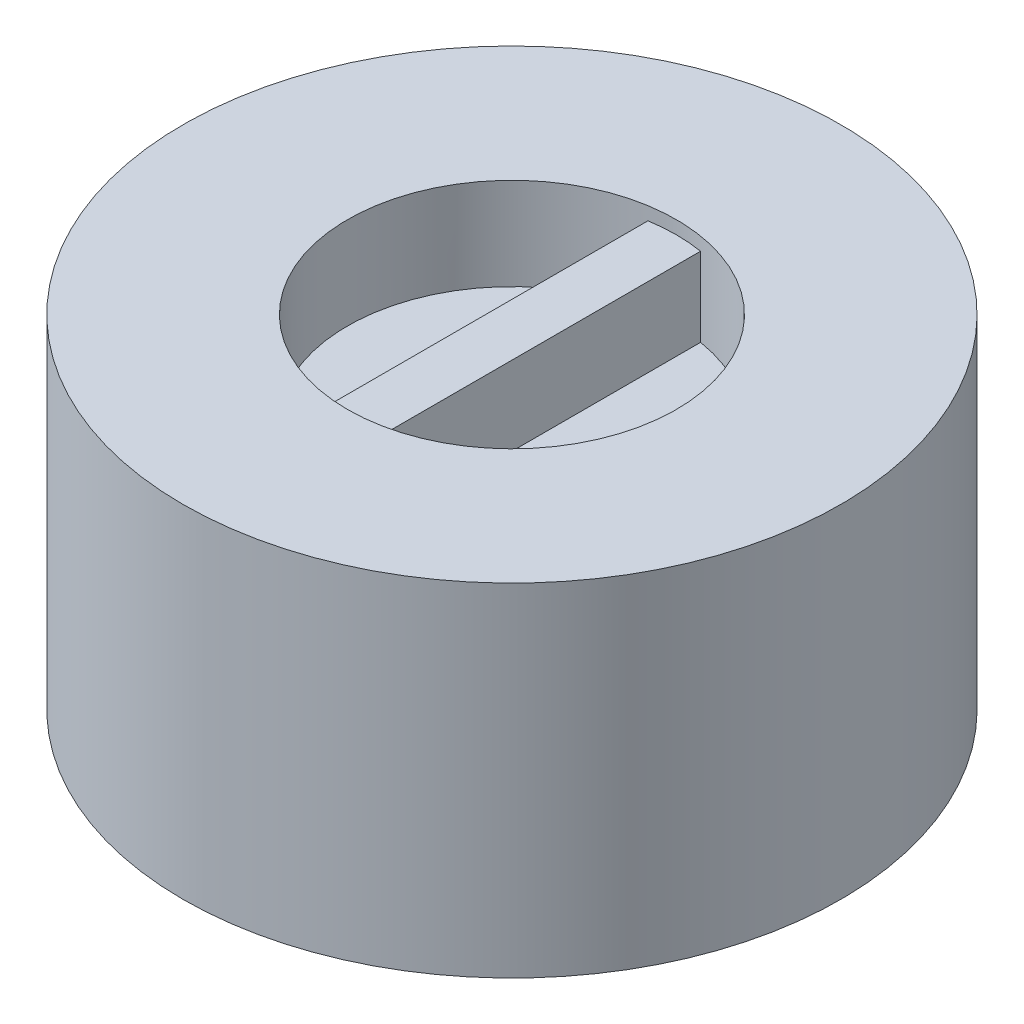
ISO-10303-21;
HEADER;
FILE_DESCRIPTION(('STEP AP214'),'2;1');
FILE_NAME('part.step','',(''),(''),'','','');
FILE_SCHEMA(('AUTOMOTIVE_DESIGN { 1 0 10303 214 1 1 1 1 }'));
ENDSEC;
DATA;
#1=APPLICATION_CONTEXT('core data for automotive mechanical design processes');
#2=APPLICATION_PROTOCOL_DEFINITION('international standard','automotive_design',2000,#1);
#3=PRODUCT_CONTEXT('',#1,'mechanical');
#4=PRODUCT('Part','Part','',(#3));
#5=PRODUCT_RELATED_PRODUCT_CATEGORY('part','',(#4));
#6=PRODUCT_DEFINITION_FORMATION('','',#4);
#7=PRODUCT_DEFINITION_CONTEXT('part definition',#1,'design');
#8=PRODUCT_DEFINITION('design','',#6,#7);
#9=PRODUCT_DEFINITION_SHAPE('','',#8);
#10=(LENGTH_UNIT() NAMED_UNIT(*) SI_UNIT(.MILLI.,.METRE.));
#11=(NAMED_UNIT(*) PLANE_ANGLE_UNIT() SI_UNIT($,.RADIAN.));
#12=(NAMED_UNIT(*) SI_UNIT($,.STERADIAN.) SOLID_ANGLE_UNIT());
#13=UNCERTAINTY_MEASURE_WITH_UNIT(LENGTH_MEASURE(1.E-05),#10,'distance_accuracy_value','');
#14=(GEOMETRIC_REPRESENTATION_CONTEXT(3) GLOBAL_UNCERTAINTY_ASSIGNED_CONTEXT((#13)) GLOBAL_UNIT_ASSIGNED_CONTEXT((#10,
#11,#12)) REPRESENTATION_CONTEXT('',''));
#15=CARTESIAN_POINT('',(0.,0.,0.));
#16=DIRECTION('',(0.,0.,1.));
#17=DIRECTION('',(1.,0.,0.));
#18=AXIS2_PLACEMENT_3D('',#15,#16,#17);
#19=CARTESIAN_POINT('',(0.,0.5,0.));
#20=DIRECTION('',(0.,-1.,0.));
#21=DIRECTION('',(0.,0.,-1.));
#22=AXIS2_PLACEMENT_3D('',#19,#20,#21);
#23=CYLINDRICAL_SURFACE('',#22,2.5);
#24=CARTESIAN_POINT('',(0.,-1.4,0.));
#25=DIRECTION('',(0.,1.,0.));
#26=DIRECTION('',(0.,0.,1.));
#27=AXIS2_PLACEMENT_3D('',#24,#25,#26);
#28=CIRCLE('',#27,2.5);
#29=CARTESIAN_POINT('',(0.,-1.4,2.5));
#30=VERTEX_POINT('',#29);
#31=EDGE_CURVE('E108',#30,#30,#28,.T.);
#32=ORIENTED_EDGE('',*,*,#31,.T.);
#33=EDGE_LOOP('',(#32));
#34=FACE_BOUND('',#33,.T.);
#35=CARTESIAN_POINT('',(0.,1.2,0.));
#36=DIRECTION('',(0.,1.,0.));
#37=DIRECTION('',(0.,0.,1.));
#38=AXIS2_PLACEMENT_3D('',#35,#36,#37);
#39=CIRCLE('',#38,2.5);
#40=CARTESIAN_POINT('',(0.,1.2,2.5));
#41=VERTEX_POINT('',#40);
#42=EDGE_CURVE('E142',#41,#41,#39,.T.);
#43=ORIENTED_EDGE('',*,*,#42,.F.);
#44=EDGE_LOOP('',(#43));
#45=FACE_BOUND('',#44,.T.);
#46=ADVANCED_FACE('F44',(#34,#45),#23,.T.);
#47=CARTESIAN_POINT('',(0.,-1.4,0.));
#48=DIRECTION('',(0.,1.,0.));
#49=DIRECTION('',(0.,0.,1.));
#50=AXIS2_PLACEMENT_3D('',#47,#48,#49);
#51=CYLINDRICAL_SURFACE('',#50,1.65);
#52=CARTESIAN_POINT('',(0.,0.,0.));
#53=DIRECTION('',(0.,1.,0.));
#54=DIRECTION('',(0.,0.,1.));
#55=AXIS2_PLACEMENT_3D('',#52,#53,#54);
#56=CIRCLE('',#55,1.65);
#57=CARTESIAN_POINT('',(1.,0.,-1.31244047484067));
#58=VERTEX_POINT('',#57);
#59=CARTESIAN_POINT('',(1.,0.,1.31244047484067));
#60=VERTEX_POINT('',#59);
#61=EDGE_CURVE('E121',#58,#60,#56,.T.);
#62=ORIENTED_EDGE('',*,*,#61,.T.);
#63=DIRECTION('',(0.,1.,0.));
#64=VECTOR('',#63,1.);
#65=CARTESIAN_POINT('',(1.,-1.4,1.31244047484067));
#66=LINE('',#65,#64);
#67=CARTESIAN_POINT('',(1.,-1.4,1.31244047484067));
#68=VERTEX_POINT('',#67);
#69=EDGE_CURVE('E107',#68,#60,#66,.T.);
#70=ORIENTED_EDGE('',*,*,#69,.F.);
#71=CARTESIAN_POINT('',(0.,-1.4,0.));
#72=DIRECTION('',(0.,1.,0.));
#73=DIRECTION('',(0.,0.,1.));
#74=AXIS2_PLACEMENT_3D('',#71,#72,#73);
#75=CIRCLE('',#74,1.65);
#76=CARTESIAN_POINT('',(1.,-1.4,-1.31244047484067));
#77=VERTEX_POINT('',#76);
#78=EDGE_CURVE('E110',#77,#68,#75,.T.);
#79=ORIENTED_EDGE('',*,*,#78,.F.);
#80=DIRECTION('',(0.,1.,0.));
#81=VECTOR('',#80,1.);
#82=CARTESIAN_POINT('',(1.,-1.4,-1.31244047484067));
#83=LINE('',#82,#81);
#84=EDGE_CURVE('E97',#77,#58,#83,.T.);
#85=ORIENTED_EDGE('',*,*,#84,.T.);
#86=EDGE_LOOP('',(#62,#70,#79,#85));
#87=FACE_BOUND('',#86,.T.);
#88=ADVANCED_FACE('F111',(#87),#51,.F.);
#89=CARTESIAN_POINT('',(1.,-1.4,0.));
#90=DIRECTION('',(-1.,0.,0.));
#91=DIRECTION('',(0.,0.,1.));
#92=AXIS2_PLACEMENT_3D('',#89,#90,#91);
#93=PLANE('',#92);
#94=DIRECTION('',(0.,0.,1.));
#95=VECTOR('',#94,1.);
#96=CARTESIAN_POINT('',(1.,0.,0.));
#97=LINE('',#96,#95);
#98=EDGE_CURVE('E104',#58,#60,#97,.T.);
#99=ORIENTED_EDGE('',*,*,#98,.F.);
#100=ORIENTED_EDGE('',*,*,#84,.F.);
#101=DIRECTION('',(0.,0.,1.));
#102=VECTOR('',#101,1.);
#103=CARTESIAN_POINT('',(1.,-1.4,0.));
#104=LINE('',#103,#102);
#105=EDGE_CURVE('E102',#77,#68,#104,.T.);
#106=ORIENTED_EDGE('',*,*,#105,.T.);
#107=ORIENTED_EDGE('',*,*,#69,.T.);
#108=EDGE_LOOP('',(#99,#100,#106,#107));
#109=FACE_BOUND('',#108,.T.);
#110=ADVANCED_FACE('F99',(#109),#93,.T.);
#111=CARTESIAN_POINT('',(0.,-1.4,0.));
#112=DIRECTION('',(0.,1.,0.));
#113=DIRECTION('',(0.,0.,1.));
#114=AXIS2_PLACEMENT_3D('',#111,#112,#113);
#115=PLANE('',#114);
#116=ORIENTED_EDGE('',*,*,#78,.T.);
#117=ORIENTED_EDGE('',*,*,#105,.F.);
#118=EDGE_LOOP('',(#116,#117));
#119=FACE_BOUND('',#118,.T.);
#120=ORIENTED_EDGE('',*,*,#31,.F.);
#121=EDGE_LOOP('',(#120));
#122=FACE_BOUND('',#121,.T.);
#123=ADVANCED_FACE('F114',(#119,#122),#115,.F.);
#124=CARTESIAN_POINT('',(0.,0.,0.));
#125=DIRECTION('',(0.,1.,0.));
#126=DIRECTION('',(0.,0.,1.));
#127=AXIS2_PLACEMENT_3D('',#124,#125,#126);
#128=PLANE('',#127);
#129=ORIENTED_EDGE('',*,*,#61,.F.);
#130=ORIENTED_EDGE('',*,*,#98,.T.);
#131=EDGE_LOOP('',(#129,#130));
#132=FACE_BOUND('',#131,.T.);
#133=ADVANCED_FACE('F190',(#132),#128,.F.);
#134=CARTESIAN_POINT('',(0.,1.2,0.));
#135=DIRECTION('',(0.,-1.,0.));
#136=DIRECTION('',(0.,0.,-1.));
#137=AXIS2_PLACEMENT_3D('',#134,#135,#136);
#138=CYLINDRICAL_SURFACE('',#137,1.25);
#139=CARTESIAN_POINT('',(0.,1.2,0.));
#140=DIRECTION('',(0.,1.,0.));
#141=DIRECTION('',(0.,0.,1.));
#142=AXIS2_PLACEMENT_3D('',#139,#140,#141);
#143=CIRCLE('',#142,1.25);
#144=CARTESIAN_POINT('',(0.,1.2,1.25));
#145=VERTEX_POINT('',#144);
#146=EDGE_CURVE('E157',#145,#145,#143,.T.);
#147=ORIENTED_EDGE('',*,*,#146,.T.);
#148=EDGE_LOOP('',(#147));
#149=FACE_BOUND('',#148,.T.);
#150=DIRECTION('',(0.,-1.,0.));
#151=VECTOR('',#150,1.);
#152=CARTESIAN_POINT('',(0.2,1.2,-1.23389626792531));
#153=LINE('',#152,#151);
#154=CARTESIAN_POINT('',(0.2,0.5,-1.23389626792531));
#155=VERTEX_POINT('',#154);
#156=CARTESIAN_POINT('',(0.2,1.1,-1.23389626792531));
#157=VERTEX_POINT('',#156);
#158=EDGE_CURVE('E151',#155,#157,#153,.F.);
#159=ORIENTED_EDGE('',*,*,#158,.F.);
#160=CARTESIAN_POINT('',(0.,0.5,0.));
#161=DIRECTION('',(0.,1.,0.));
#162=DIRECTION('',(0.,0.,1.));
#163=AXIS2_PLACEMENT_3D('',#160,#161,#162);
#164=CIRCLE('',#163,1.25);
#165=CARTESIAN_POINT('',(0.2,0.5,1.23389626792531));
#166=VERTEX_POINT('',#165);
#167=EDGE_CURVE('E57',#166,#155,#164,.T.);
#168=ORIENTED_EDGE('',*,*,#167,.F.);
#169=DIRECTION('',(0.,-1.,0.));
#170=VECTOR('',#169,1.);
#171=CARTESIAN_POINT('',(0.2,1.2,1.23389626792531));
#172=LINE('',#171,#170);
#173=CARTESIAN_POINT('',(0.2,1.1,1.23389626792531));
#174=VERTEX_POINT('',#173);
#175=EDGE_CURVE('E64',#174,#166,#172,.T.);
#176=ORIENTED_EDGE('',*,*,#175,.F.);
#177=CARTESIAN_POINT('',(0.,1.1,0.));
#178=DIRECTION('',(0.,1.,0.));
#179=DIRECTION('',(0.,0.,1.));
#180=AXIS2_PLACEMENT_3D('',#177,#178,#179);
#181=CIRCLE('',#180,1.25);
#182=CARTESIAN_POINT('',(-0.2,1.1,1.23389626792531));
#183=VERTEX_POINT('',#182);
#184=EDGE_CURVE('E47',#174,#183,#181,.F.);
#185=ORIENTED_EDGE('',*,*,#184,.T.);
#186=DIRECTION('',(0.,-1.,0.));
#187=VECTOR('',#186,1.);
#188=CARTESIAN_POINT('',(-0.2,1.2,1.23389626792531));
#189=LINE('',#188,#187);
#190=CARTESIAN_POINT('',(-0.2,0.5,1.23389626792531));
#191=VERTEX_POINT('',#190);
#192=EDGE_CURVE('E131',#183,#191,#189,.T.);
#193=ORIENTED_EDGE('',*,*,#192,.T.);
#194=CARTESIAN_POINT('',(-0.2,0.5,-1.23389626792531));
#195=VERTEX_POINT('',#194);
#196=EDGE_CURVE('E154',#195,#191,#164,.T.);
#197=ORIENTED_EDGE('',*,*,#196,.F.);
#198=DIRECTION('',(0.,-1.,0.));
#199=VECTOR('',#198,1.);
#200=CARTESIAN_POINT('',(-0.2,1.2,-1.23389626792531));
#201=LINE('',#200,#199);
#202=CARTESIAN_POINT('',(-0.2,1.1,-1.23389626792531));
#203=VERTEX_POINT('',#202);
#204=EDGE_CURVE('E155',#195,#203,#201,.F.);
#205=ORIENTED_EDGE('',*,*,#204,.T.);
#206=EDGE_CURVE('E12',#203,#157,#181,.F.);
#207=ORIENTED_EDGE('',*,*,#206,.T.);
#208=EDGE_LOOP('',(#159,#168,#176,#185,#193,#197,#205,#207));
#209=FACE_BOUND('',#208,.T.);
#210=ADVANCED_FACE('F129',(#149,#209),#138,.F.);
#211=CARTESIAN_POINT('',(0.,1.2,0.));
#212=DIRECTION('',(0.,1.,0.));
#213=DIRECTION('',(0.,0.,1.));
#214=AXIS2_PLACEMENT_3D('',#211,#212,#213);
#215=PLANE('',#214);
#216=ORIENTED_EDGE('',*,*,#42,.T.);
#217=EDGE_LOOP('',(#216));
#218=FACE_BOUND('',#217,.T.);
#219=ORIENTED_EDGE('',*,*,#146,.F.);
#220=EDGE_LOOP('',(#219));
#221=FACE_BOUND('',#220,.T.);
#222=ADVANCED_FACE('F182',(#218,#221),#215,.T.);
#223=CARTESIAN_POINT('',(0.,1.1,0.));
#224=DIRECTION('',(0.,1.,0.));
#225=DIRECTION('',(0.,0.,1.));
#226=AXIS2_PLACEMENT_3D('',#223,#224,#225);
#227=PLANE('',#226);
#228=ORIENTED_EDGE('',*,*,#206,.F.);
#229=DIRECTION('',(0.,0.,-1.));
#230=VECTOR('',#229,1.);
#231=CARTESIAN_POINT('',(-0.2,1.1,1.25));
#232=LINE('',#231,#230);
#233=EDGE_CURVE('E123',#183,#203,#232,.T.);
#234=ORIENTED_EDGE('',*,*,#233,.F.);
#235=ORIENTED_EDGE('',*,*,#184,.F.);
#236=DIRECTION('',(0.,0.,-1.));
#237=VECTOR('',#236,1.);
#238=CARTESIAN_POINT('',(0.2,1.1,1.25));
#239=LINE('',#238,#237);
#240=EDGE_CURVE('E145',#174,#157,#239,.T.);
#241=ORIENTED_EDGE('',*,*,#240,.T.);
#242=EDGE_LOOP('',(#228,#234,#235,#241));
#243=FACE_BOUND('',#242,.T.);
#244=ADVANCED_FACE('F144',(#243),#227,.T.);
#245=CARTESIAN_POINT('',(-0.2,1.1,1.25));
#246=DIRECTION('',(-1.,0.,0.));
#247=DIRECTION('',(0.,0.,1.));
#248=AXIS2_PLACEMENT_3D('',#245,#246,#247);
#249=PLANE('',#248);
#250=ORIENTED_EDGE('',*,*,#204,.F.);
#251=DIRECTION('',(0.,0.,-1.));
#252=VECTOR('',#251,1.);
#253=CARTESIAN_POINT('',(-0.2,0.5,1.25));
#254=LINE('',#253,#252);
#255=EDGE_CURVE('E141',#191,#195,#254,.T.);
#256=ORIENTED_EDGE('',*,*,#255,.F.);
#257=ORIENTED_EDGE('',*,*,#192,.F.);
#258=ORIENTED_EDGE('',*,*,#233,.T.);
#259=EDGE_LOOP('',(#250,#256,#257,#258));
#260=FACE_BOUND('',#259,.T.);
#261=ADVANCED_FACE('F138',(#260),#249,.T.);
#262=CARTESIAN_POINT('',(0.2,1.1,1.25));
#263=DIRECTION('',(-1.,0.,0.));
#264=DIRECTION('',(0.,0.,1.));
#265=AXIS2_PLACEMENT_3D('',#262,#263,#264);
#266=PLANE('',#265);
#267=DIRECTION('',(0.,0.,-1.));
#268=VECTOR('',#267,1.);
#269=CARTESIAN_POINT('',(0.2,0.5,1.25));
#270=LINE('',#269,#268);
#271=EDGE_CURVE('E150',#166,#155,#270,.T.);
#272=ORIENTED_EDGE('',*,*,#271,.T.);
#273=ORIENTED_EDGE('',*,*,#158,.T.);
#274=ORIENTED_EDGE('',*,*,#240,.F.);
#275=ORIENTED_EDGE('',*,*,#175,.T.);
#276=EDGE_LOOP('',(#272,#273,#274,#275));
#277=FACE_BOUND('',#276,.T.);
#278=ADVANCED_FACE('F163',(#277),#266,.F.);
#279=CARTESIAN_POINT('',(0.,0.5,0.));
#280=DIRECTION('',(0.,1.,0.));
#281=DIRECTION('',(0.,0.,1.));
#282=AXIS2_PLACEMENT_3D('',#279,#280,#281);
#283=PLANE('',#282);
#284=ORIENTED_EDGE('',*,*,#167,.T.);
#285=ORIENTED_EDGE('',*,*,#271,.F.);
#286=EDGE_LOOP('',(#284,#285));
#287=FACE_BOUND('',#286,.T.);
#288=ADVANCED_FACE('F164',(#287),#283,.T.);
#289=ORIENTED_EDGE('',*,*,#196,.T.);
#290=ORIENTED_EDGE('',*,*,#255,.T.);
#291=EDGE_LOOP('',(#289,#290));
#292=FACE_BOUND('',#291,.T.);
#293=ADVANCED_FACE('F153',(#292),#283,.T.);
#294=CLOSED_SHELL('',(#46,#88,#110,#123,#133,#210,#222,#244,#261,#278,#288,#293));
#295=MANIFOLD_SOLID_BREP('B2',#294);
#296=ADVANCED_BREP_SHAPE_REPRESENTATION('',(#18,#295),#14);
#297=SHAPE_DEFINITION_REPRESENTATION(#9,#296);
ENDSEC;
END-ISO-10303-21;
